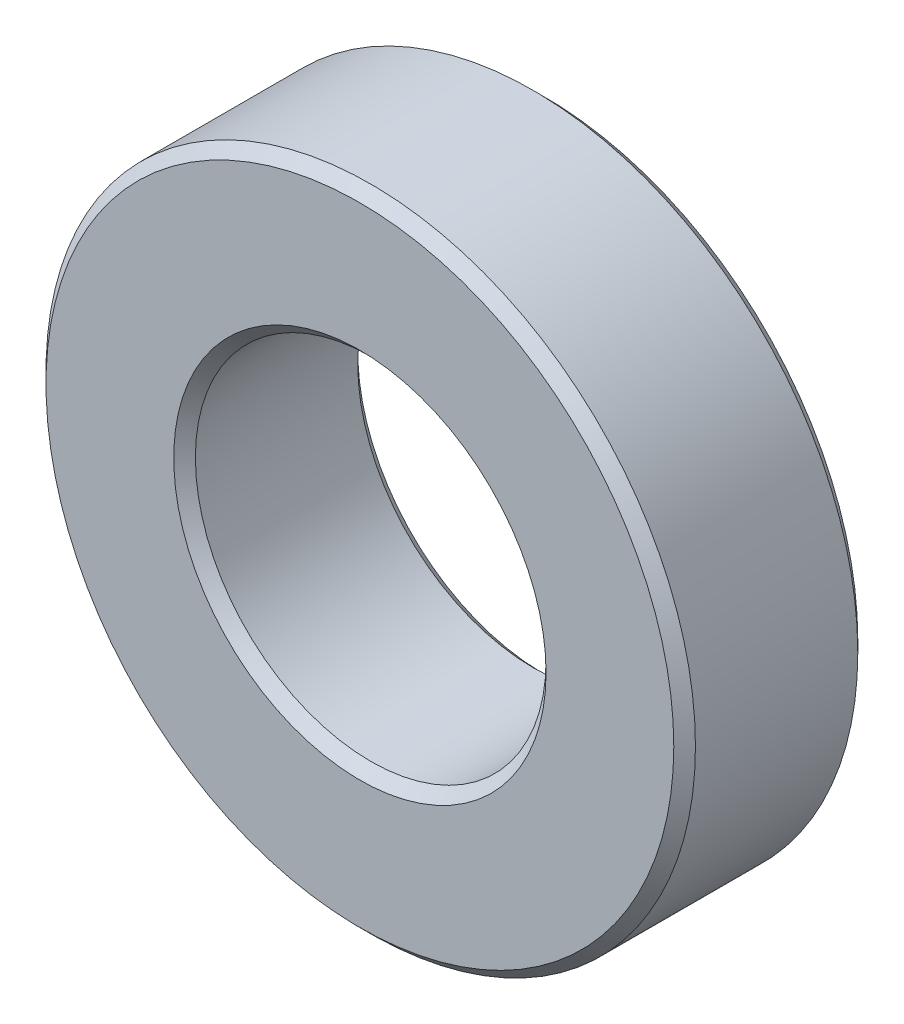
ISO-10303-21;
HEADER;
FILE_DESCRIPTION(('STEP AP214'),'2;1');
FILE_NAME('part.step','',(''),(''),'','','');
FILE_SCHEMA(('AUTOMOTIVE_DESIGN { 1 0 10303 214 1 1 1 1 }'));
ENDSEC;
DATA;
#1=APPLICATION_CONTEXT('core data for automotive mechanical design processes');
#2=APPLICATION_PROTOCOL_DEFINITION('international standard','automotive_design',2000,#1);
#3=PRODUCT_CONTEXT('',#1,'mechanical');
#4=PRODUCT('Part','Part','',(#3));
#5=PRODUCT_RELATED_PRODUCT_CATEGORY('part','',(#4));
#6=PRODUCT_DEFINITION_FORMATION('','',#4);
#7=PRODUCT_DEFINITION_CONTEXT('part definition',#1,'design');
#8=PRODUCT_DEFINITION('design','',#6,#7);
#9=PRODUCT_DEFINITION_SHAPE('','',#8);
#10=(LENGTH_UNIT() NAMED_UNIT(*) SI_UNIT(.MILLI.,.METRE.));
#11=(NAMED_UNIT(*) PLANE_ANGLE_UNIT() SI_UNIT($,.RADIAN.));
#12=(NAMED_UNIT(*) SI_UNIT($,.STERADIAN.) SOLID_ANGLE_UNIT());
#13=UNCERTAINTY_MEASURE_WITH_UNIT(LENGTH_MEASURE(1.E-05),#10,'distance_accuracy_value','');
#14=(GEOMETRIC_REPRESENTATION_CONTEXT(3) GLOBAL_UNCERTAINTY_ASSIGNED_CONTEXT((#13)) GLOBAL_UNIT_ASSIGNED_CONTEXT((#10,
#11,#12)) REPRESENTATION_CONTEXT('',''));
#15=CARTESIAN_POINT('',(0.,0.,0.));
#16=DIRECTION('',(0.,0.,1.));
#17=DIRECTION('',(1.,0.,0.));
#18=AXIS2_PLACEMENT_3D('',#15,#16,#17);
#19=CARTESIAN_POINT('',(0.,0.,8.5));
#20=DIRECTION('',(0.,0.,1.));
#21=DIRECTION('',(1.,0.,0.));
#22=AXIS2_PLACEMENT_3D('',#19,#20,#21);
#23=PLANE('',#22);
#24=CARTESIAN_POINT('',(0.,0.,8.5));
#25=DIRECTION('',(0.,0.,1.));
#26=DIRECTION('',(1.,0.,0.));
#27=AXIS2_PLACEMENT_3D('',#24,#25,#26);
#28=CIRCLE('',#27,8.59999999999999);
#29=CARTESIAN_POINT('',(8.59999999999999,0.,8.5));
#30=VERTEX_POINT('',#29);
#31=EDGE_CURVE('E10',#30,#30,#28,.F.);
#32=ORIENTED_EDGE('',*,*,#31,.T.);
#33=EDGE_LOOP('',(#32));
#34=FACE_BOUND('',#33,.T.);
#35=CARTESIAN_POINT('',(0.,0.,8.5));
#36=DIRECTION('',(0.,0.,1.));
#37=DIRECTION('',(1.,0.,0.));
#38=AXIS2_PLACEMENT_3D('',#35,#36,#37);
#39=CIRCLE('',#38,14.5);
#40=CARTESIAN_POINT('',(14.5,0.,8.5));
#41=VERTEX_POINT('',#40);
#42=EDGE_CURVE('E40',#41,#41,#39,.T.);
#43=ORIENTED_EDGE('',*,*,#42,.T.);
#44=EDGE_LOOP('',(#43));
#45=FACE_BOUND('',#44,.T.);
#46=ADVANCED_FACE('F33',(#34,#45),#23,.T.);
#47=CARTESIAN_POINT('',(0.,0.,0.));
#48=DIRECTION('',(0.,0.,1.));
#49=DIRECTION('',(1.,0.,0.));
#50=AXIS2_PLACEMENT_3D('',#47,#48,#49);
#51=PLANE('',#50);
#52=CARTESIAN_POINT('',(0.,0.,0.));
#53=DIRECTION('',(0.,0.,1.));
#54=DIRECTION('',(1.,0.,0.));
#55=AXIS2_PLACEMENT_3D('',#52,#53,#54);
#56=CIRCLE('',#55,8.6);
#57=CARTESIAN_POINT('',(8.6,0.,0.));
#58=VERTEX_POINT('',#57);
#59=EDGE_CURVE('E59',#58,#58,#56,.T.);
#60=ORIENTED_EDGE('',*,*,#59,.T.);
#61=EDGE_LOOP('',(#60));
#62=FACE_BOUND('',#61,.T.);
#63=CARTESIAN_POINT('',(0.,0.,0.));
#64=DIRECTION('',(0.,0.,1.));
#65=DIRECTION('',(1.,0.,0.));
#66=AXIS2_PLACEMENT_3D('',#63,#64,#65);
#67=CIRCLE('',#66,14.5);
#68=CARTESIAN_POINT('',(14.5,0.,0.));
#69=VERTEX_POINT('',#68);
#70=EDGE_CURVE('E62',#69,#69,#67,.F.);
#71=ORIENTED_EDGE('',*,*,#70,.T.);
#72=EDGE_LOOP('',(#71));
#73=FACE_BOUND('',#72,.T.);
#74=ADVANCED_FACE('F66',(#62,#73),#51,.F.);
#75=CARTESIAN_POINT('',(0.,0.,8.5));
#76=DIRECTION('',(0.,0.,-1.));
#77=DIRECTION('',(-1.,0.,0.));
#78=AXIS2_PLACEMENT_3D('',#75,#76,#77);
#79=CYLINDRICAL_SURFACE('',#78,15.);
#80=CARTESIAN_POINT('',(0.,0.,0.500000000000002));
#81=DIRECTION('',(0.,0.,1.));
#82=DIRECTION('',(1.,0.,0.));
#83=AXIS2_PLACEMENT_3D('',#80,#81,#82);
#84=CIRCLE('',#83,15.);
#85=CARTESIAN_POINT('',(15.,0.,0.500000000000002));
#86=VERTEX_POINT('',#85);
#87=EDGE_CURVE('E44',#86,#86,#84,.T.);
#88=ORIENTED_EDGE('',*,*,#87,.T.);
#89=EDGE_LOOP('',(#88));
#90=FACE_BOUND('',#89,.T.);
#91=CARTESIAN_POINT('',(0.,0.,7.99999999999998));
#92=DIRECTION('',(0.,0.,1.));
#93=DIRECTION('',(1.,0.,0.));
#94=AXIS2_PLACEMENT_3D('',#91,#92,#93);
#95=CIRCLE('',#94,15.);
#96=CARTESIAN_POINT('',(15.,0.,7.99999999999998));
#97=VERTEX_POINT('',#96);
#98=EDGE_CURVE('E48',#97,#97,#95,.F.);
#99=ORIENTED_EDGE('',*,*,#98,.T.);
#100=EDGE_LOOP('',(#99));
#101=FACE_BOUND('',#100,.T.);
#102=ADVANCED_FACE('F76',(#90,#101),#79,.T.);
#103=CARTESIAN_POINT('',(0.,0.,8.5));
#104=DIRECTION('',(0.,0.,-1.));
#105=DIRECTION('',(-1.,0.,0.));
#106=AXIS2_PLACEMENT_3D('',#103,#104,#105);
#107=CYLINDRICAL_SURFACE('',#106,8.1);
#108=CARTESIAN_POINT('',(0.,0.,0.500000000000007));
#109=DIRECTION('',(0.,0.,1.));
#110=DIRECTION('',(1.,0.,0.));
#111=AXIS2_PLACEMENT_3D('',#108,#109,#110);
#112=CIRCLE('',#111,8.1);
#113=CARTESIAN_POINT('',(8.1,0.,0.500000000000007));
#114=VERTEX_POINT('',#113);
#115=EDGE_CURVE('E53',#114,#114,#112,.F.);
#116=ORIENTED_EDGE('',*,*,#115,.T.);
#117=EDGE_LOOP('',(#116));
#118=FACE_BOUND('',#117,.T.);
#119=CARTESIAN_POINT('',(0.,0.,8.));
#120=DIRECTION('',(0.,0.,1.));
#121=DIRECTION('',(1.,0.,0.));
#122=AXIS2_PLACEMENT_3D('',#119,#120,#121);
#123=CIRCLE('',#122,8.1);
#124=CARTESIAN_POINT('',(8.1,0.,8.));
#125=VERTEX_POINT('',#124);
#126=EDGE_CURVE('E56',#125,#125,#123,.T.);
#127=ORIENTED_EDGE('',*,*,#126,.T.);
#128=EDGE_LOOP('',(#127));
#129=FACE_BOUND('',#128,.T.);
#130=ADVANCED_FACE('F79',(#118,#129),#107,.F.);
#131=CARTESIAN_POINT('',(0.,0.,0.));
#132=DIRECTION('',(0.,0.,-1.));
#133=DIRECTION('',(-1.,0.,0.));
#134=AXIS2_PLACEMENT_3D('',#131,#132,#133);
#135=CONICAL_SURFACE('',#134,8.6,0.785398163397445);
#136=ORIENTED_EDGE('',*,*,#115,.F.);
#137=EDGE_LOOP('',(#136));
#138=FACE_BOUND('',#137,.T.);
#139=ORIENTED_EDGE('',*,*,#59,.F.);
#140=EDGE_LOOP('',(#139));
#141=FACE_BOUND('',#140,.T.);
#142=ADVANCED_FACE('F72',(#138,#141),#135,.F.);
#143=CARTESIAN_POINT('',(0.,0.,0.500000000000002));
#144=DIRECTION('',(0.,0.,1.));
#145=DIRECTION('',(1.,0.,0.));
#146=AXIS2_PLACEMENT_3D('',#143,#144,#145);
#147=CONICAL_SURFACE('',#146,15.,0.785398163397452);
#148=ORIENTED_EDGE('',*,*,#70,.F.);
#149=EDGE_LOOP('',(#148));
#150=FACE_BOUND('',#149,.T.);
#151=ORIENTED_EDGE('',*,*,#87,.F.);
#152=EDGE_LOOP('',(#151));
#153=FACE_BOUND('',#152,.T.);
#154=ADVANCED_FACE('F68',(#150,#153),#147,.T.);
#155=CARTESIAN_POINT('',(0.,0.,8.));
#156=DIRECTION('',(0.,0.,1.));
#157=DIRECTION('',(1.,0.,0.));
#158=AXIS2_PLACEMENT_3D('',#155,#156,#157);
#159=CONICAL_SURFACE('',#158,8.1,0.785398163397445);
#160=ORIENTED_EDGE('',*,*,#31,.F.);
#161=EDGE_LOOP('',(#160));
#162=FACE_BOUND('',#161,.T.);
#163=ORIENTED_EDGE('',*,*,#126,.F.);
#164=EDGE_LOOP('',(#163));
#165=FACE_BOUND('',#164,.T.);
#166=ADVANCED_FACE('F71',(#162,#165),#159,.F.);
#167=CARTESIAN_POINT('',(0.,0.,8.5));
#168=DIRECTION('',(0.,0.,-1.));
#169=DIRECTION('',(-1.,0.,0.));
#170=AXIS2_PLACEMENT_3D('',#167,#168,#169);
#171=CONICAL_SURFACE('',#170,14.5,0.785398163397443);
#172=ORIENTED_EDGE('',*,*,#98,.F.);
#173=EDGE_LOOP('',(#172));
#174=FACE_BOUND('',#173,.T.);
#175=ORIENTED_EDGE('',*,*,#42,.F.);
#176=EDGE_LOOP('',(#175));
#177=FACE_BOUND('',#176,.T.);
#178=ADVANCED_FACE('F35',(#174,#177),#171,.T.);
#179=CLOSED_SHELL('',(#46,#74,#102,#130,#142,#154,#166,#178));
#180=MANIFOLD_SOLID_BREP('B2',#179);
#181=ADVANCED_BREP_SHAPE_REPRESENTATION('',(#18,#180),#14);
#182=SHAPE_DEFINITION_REPRESENTATION(#9,#181);
ENDSEC;
END-ISO-10303-21;
